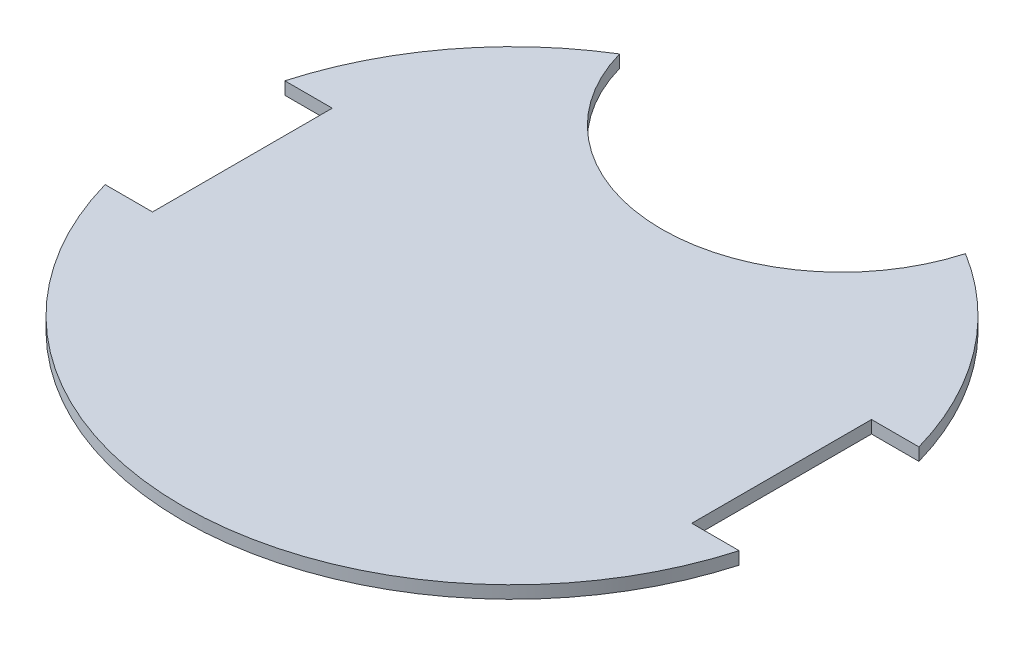
ISO-10303-21;
HEADER;
FILE_DESCRIPTION(('STEP AP214'),'2;1');
FILE_NAME('part.step','',(''),(''),'','','');
FILE_SCHEMA(('AUTOMOTIVE_DESIGN { 1 0 10303 214 1 1 1 1 }'));
ENDSEC;
DATA;
#1=APPLICATION_CONTEXT('core data for automotive mechanical design processes');
#2=APPLICATION_PROTOCOL_DEFINITION('international standard','automotive_design',2000,#1);
#3=PRODUCT_CONTEXT('',#1,'mechanical');
#4=PRODUCT('Part','Part','',(#3));
#5=PRODUCT_RELATED_PRODUCT_CATEGORY('part','',(#4));
#6=PRODUCT_DEFINITION_FORMATION('','',#4);
#7=PRODUCT_DEFINITION_CONTEXT('part definition',#1,'design');
#8=PRODUCT_DEFINITION('design','',#6,#7);
#9=PRODUCT_DEFINITION_SHAPE('','',#8);
#10=(LENGTH_UNIT() NAMED_UNIT(*) SI_UNIT(.MILLI.,.METRE.));
#11=(NAMED_UNIT(*) PLANE_ANGLE_UNIT() SI_UNIT($,.RADIAN.));
#12=(NAMED_UNIT(*) SI_UNIT($,.STERADIAN.) SOLID_ANGLE_UNIT());
#13=UNCERTAINTY_MEASURE_WITH_UNIT(LENGTH_MEASURE(1.E-05),#10,'distance_accuracy_value','');
#14=(GEOMETRIC_REPRESENTATION_CONTEXT(3) GLOBAL_UNCERTAINTY_ASSIGNED_CONTEXT((#13)) GLOBAL_UNIT_ASSIGNED_CONTEXT((#10,
#11,#12)) REPRESENTATION_CONTEXT('',''));
#15=CARTESIAN_POINT('',(0.,0.,0.));
#16=DIRECTION('',(0.,0.,1.));
#17=DIRECTION('',(1.,0.,0.));
#18=AXIS2_PLACEMENT_3D('',#15,#16,#17);
#19=CARTESIAN_POINT('',(0.,0.,0.));
#20=DIRECTION('',(0.,1.,0.));
#21=DIRECTION('',(0.,0.,1.));
#22=AXIS2_PLACEMENT_3D('',#19,#20,#21);
#23=CYLINDRICAL_SURFACE('',#22,139.7);
#24=DIRECTION('',(0.,1.,0.));
#25=VECTOR('',#24,1.);
#26=CARTESIAN_POINT('',(134.404166602081,0.,38.1));
#27=LINE('',#26,#25);
#28=CARTESIAN_POINT('',(134.404166602081,5.334,38.1));
#29=VERTEX_POINT('',#28);
#30=CARTESIAN_POINT('',(134.404166602081,0.,38.1));
#31=VERTEX_POINT('',#30);
#32=EDGE_CURVE('E141',#29,#31,#27,.F.);
#33=ORIENTED_EDGE('',*,*,#32,.F.);
#34=CARTESIAN_POINT('',(0.,5.334,0.));
#35=DIRECTION('',(0.,1.,0.));
#36=DIRECTION('',(0.,0.,1.));
#37=AXIS2_PLACEMENT_3D('',#34,#35,#36);
#38=CIRCLE('',#37,139.7);
#39=CARTESIAN_POINT('',(-134.404166602081,5.334,38.1));
#40=VERTEX_POINT('',#39);
#41=EDGE_CURVE('E174',#40,#29,#38,.T.);
#42=ORIENTED_EDGE('',*,*,#41,.F.);
#43=DIRECTION('',(0.,1.,0.));
#44=VECTOR('',#43,1.);
#45=CARTESIAN_POINT('',(-134.404166602081,0.,38.1));
#46=LINE('',#45,#44);
#47=CARTESIAN_POINT('',(-134.404166602081,0.,38.1));
#48=VERTEX_POINT('',#47);
#49=EDGE_CURVE('E161',#48,#40,#46,.T.);
#50=ORIENTED_EDGE('',*,*,#49,.F.);
#51=CARTESIAN_POINT('',(0.,0.,0.));
#52=DIRECTION('',(0.,1.,0.));
#53=DIRECTION('',(0.,0.,1.));
#54=AXIS2_PLACEMENT_3D('',#51,#52,#53);
#55=CIRCLE('',#54,139.7);
#56=EDGE_CURVE('E182',#48,#31,#55,.T.);
#57=ORIENTED_EDGE('',*,*,#56,.T.);
#58=EDGE_LOOP('',(#33,#42,#50,#57));
#59=FACE_BOUND('',#58,.T.);
#60=ADVANCED_FACE('F36',(#59),#23,.T.);
#61=DIRECTION('',(0.,1.,0.));
#62=VECTOR('',#61,1.);
#63=CARTESIAN_POINT('',(134.404166602081,0.,-38.1));
#64=LINE('',#63,#62);
#65=CARTESIAN_POINT('',(134.404166602081,0.,-38.1));
#66=VERTEX_POINT('',#65);
#67=CARTESIAN_POINT('',(134.404166602081,5.334,-38.1));
#68=VERTEX_POINT('',#67);
#69=EDGE_CURVE('E50',#66,#68,#64,.T.);
#70=ORIENTED_EDGE('',*,*,#69,.F.);
#71=CARTESIAN_POINT('',(73.3113636011353,0.,-118.918181818182));
#72=VERTEX_POINT('',#71);
#73=EDGE_CURVE('E131',#66,#72,#55,.T.);
#74=ORIENTED_EDGE('',*,*,#73,.T.);
#75=DIRECTION('',(0.,1.,0.));
#76=VECTOR('',#75,1.);
#77=CARTESIAN_POINT('',(73.3113636011353,0.,-118.918181818182));
#78=LINE('',#77,#76);
#79=CARTESIAN_POINT('',(73.3113636011353,5.334,-118.918181818182));
#80=VERTEX_POINT('',#79);
#81=EDGE_CURVE('E175',#72,#80,#78,.T.);
#82=ORIENTED_EDGE('',*,*,#81,.T.);
#83=EDGE_CURVE('E171',#68,#80,#38,.T.);
#84=ORIENTED_EDGE('',*,*,#83,.F.);
#85=EDGE_LOOP('',(#70,#74,#82,#84));
#86=FACE_BOUND('',#85,.T.);
#87=ADVANCED_FACE('F210',(#86),#23,.T.);
#88=CARTESIAN_POINT('',(0.,0.,0.));
#89=DIRECTION('',(0.,1.,0.));
#90=DIRECTION('',(0.,0.,1.));
#91=AXIS2_PLACEMENT_3D('',#88,#89,#90);
#92=PLANE('',#91);
#93=DIRECTION('',(0.,0.,1.));
#94=VECTOR('',#93,1.);
#95=CARTESIAN_POINT('',(114.3,0.,-38.1));
#96=LINE('',#95,#94);
#97=CARTESIAN_POINT('',(114.3,0.,-38.1));
#98=VERTEX_POINT('',#97);
#99=CARTESIAN_POINT('',(114.3,0.,38.1));
#100=VERTEX_POINT('',#99);
#101=EDGE_CURVE('E123',#98,#100,#96,.T.);
#102=ORIENTED_EDGE('',*,*,#101,.T.);
#103=DIRECTION('',(1.,0.,0.));
#104=VECTOR('',#103,1.);
#105=CARTESIAN_POINT('',(165.1,0.,38.1));
#106=LINE('',#105,#104);
#107=EDGE_CURVE('E120',#100,#31,#106,.T.);
#108=ORIENTED_EDGE('',*,*,#107,.T.);
#109=ORIENTED_EDGE('',*,*,#56,.F.);
#110=DIRECTION('',(1.,0.,0.));
#111=VECTOR('',#110,1.);
#112=CARTESIAN_POINT('',(-165.1,0.,38.1));
#113=LINE('',#112,#111);
#114=CARTESIAN_POINT('',(-114.3,0.,38.1));
#115=VERTEX_POINT('',#114);
#116=EDGE_CURVE('E150',#48,#115,#113,.T.);
#117=ORIENTED_EDGE('',*,*,#116,.T.);
#118=DIRECTION('',(0.,0.,-1.));
#119=VECTOR('',#118,1.);
#120=CARTESIAN_POINT('',(-114.3,0.,-38.1));
#121=LINE('',#120,#119);
#122=CARTESIAN_POINT('',(-114.3,0.,-38.1));
#123=VERTEX_POINT('',#122);
#124=EDGE_CURVE('E143',#115,#123,#121,.T.);
#125=ORIENTED_EDGE('',*,*,#124,.T.);
#126=DIRECTION('',(-1.,0.,0.));
#127=VECTOR('',#126,1.);
#128=CARTESIAN_POINT('',(-165.1,0.,-38.1));
#129=LINE('',#128,#127);
#130=CARTESIAN_POINT('',(-134.404166602081,0.,-38.1));
#131=VERTEX_POINT('',#130);
#132=EDGE_CURVE('E146',#123,#131,#129,.T.);
#133=ORIENTED_EDGE('',*,*,#132,.T.);
#134=CARTESIAN_POINT('',(-73.3113636011352,0.,-118.918181818182));
#135=VERTEX_POINT('',#134);
#136=EDGE_CURVE('E180',#135,#131,#55,.T.);
#137=ORIENTED_EDGE('',*,*,#136,.F.);
#138=CARTESIAN_POINT('',(0.,0.,-139.7));
#139=DIRECTION('',(0.,-1.,0.));
#140=DIRECTION('',(0.,0.,1.));
#141=AXIS2_PLACEMENT_3D('',#138,#139,#140);
#142=CIRCLE('',#141,76.2);
#143=EDGE_CURVE('E164',#72,#135,#142,.T.);
#144=ORIENTED_EDGE('',*,*,#143,.F.);
#145=ORIENTED_EDGE('',*,*,#73,.F.);
#146=DIRECTION('',(-1.,0.,0.));
#147=VECTOR('',#146,1.);
#148=CARTESIAN_POINT('',(165.1,0.,-38.1));
#149=LINE('',#148,#147);
#150=EDGE_CURVE('E115',#66,#98,#149,.T.);
#151=ORIENTED_EDGE('',*,*,#150,.T.);
#152=EDGE_LOOP('',(#102,#108,#109,#117,#125,#133,#137,#144,#145,#151));
#153=FACE_BOUND('',#152,.T.);
#154=ADVANCED_FACE('F38',(#153),#92,.F.);
#155=DIRECTION('',(0.,1.,0.));
#156=VECTOR('',#155,1.);
#157=CARTESIAN_POINT('',(-134.404166602081,0.,-38.1));
#158=LINE('',#157,#156);
#159=CARTESIAN_POINT('',(-134.404166602081,5.334,-38.1));
#160=VERTEX_POINT('',#159);
#161=EDGE_CURVE('E158',#160,#131,#158,.F.);
#162=ORIENTED_EDGE('',*,*,#161,.F.);
#163=CARTESIAN_POINT('',(-73.3113636011352,5.334,-118.918181818182));
#164=VERTEX_POINT('',#163);
#165=EDGE_CURVE('E168',#164,#160,#38,.T.);
#166=ORIENTED_EDGE('',*,*,#165,.F.);
#167=DIRECTION('',(0.,1.,0.));
#168=VECTOR('',#167,1.);
#169=CARTESIAN_POINT('',(-73.3113636011352,0.,-118.918181818182));
#170=LINE('',#169,#168);
#171=EDGE_CURVE('E167',#135,#164,#170,.T.);
#172=ORIENTED_EDGE('',*,*,#171,.F.);
#173=ORIENTED_EDGE('',*,*,#136,.T.);
#174=EDGE_LOOP('',(#162,#166,#172,#173));
#175=FACE_BOUND('',#174,.T.);
#176=ADVANCED_FACE('F200',(#175),#23,.T.);
#177=CARTESIAN_POINT('',(0.,0.,-139.7));
#178=DIRECTION('',(0.,1.,0.));
#179=DIRECTION('',(0.,0.,1.));
#180=AXIS2_PLACEMENT_3D('',#177,#178,#179);
#181=CYLINDRICAL_SURFACE('',#180,76.2);
#182=CARTESIAN_POINT('',(0.,5.334,-139.7));
#183=DIRECTION('',(0.,-1.,0.));
#184=DIRECTION('',(0.,0.,1.));
#185=AXIS2_PLACEMENT_3D('',#182,#183,#184);
#186=CIRCLE('',#185,76.2);
#187=EDGE_CURVE('E163',#80,#164,#186,.T.);
#188=ORIENTED_EDGE('',*,*,#187,.F.);
#189=ORIENTED_EDGE('',*,*,#81,.F.);
#190=ORIENTED_EDGE('',*,*,#143,.T.);
#191=ORIENTED_EDGE('',*,*,#171,.T.);
#192=EDGE_LOOP('',(#188,#189,#190,#191));
#193=FACE_BOUND('',#192,.T.);
#194=ADVANCED_FACE('F212',(#193),#181,.F.);
#195=CARTESIAN_POINT('',(0.,5.334,0.));
#196=DIRECTION('',(0.,1.,0.));
#197=DIRECTION('',(0.,0.,1.));
#198=AXIS2_PLACEMENT_3D('',#195,#196,#197);
#199=PLANE('',#198);
#200=DIRECTION('',(1.,0.,0.));
#201=VECTOR('',#200,1.);
#202=CARTESIAN_POINT('',(165.1,5.334,38.1));
#203=LINE('',#202,#201);
#204=CARTESIAN_POINT('',(114.3,5.334,38.1));
#205=VERTEX_POINT('',#204);
#206=EDGE_CURVE('E132',#205,#29,#203,.T.);
#207=ORIENTED_EDGE('',*,*,#206,.F.);
#208=DIRECTION('',(0.,0.,1.));
#209=VECTOR('',#208,1.);
#210=CARTESIAN_POINT('',(114.3,5.334,-38.1));
#211=LINE('',#210,#209);
#212=CARTESIAN_POINT('',(114.3,5.334,-38.1));
#213=VERTEX_POINT('',#212);
#214=EDGE_CURVE('E134',#213,#205,#211,.T.);
#215=ORIENTED_EDGE('',*,*,#214,.F.);
#216=DIRECTION('',(-1.,0.,0.));
#217=VECTOR('',#216,1.);
#218=CARTESIAN_POINT('',(0.,5.334,-38.1));
#219=LINE('',#218,#217);
#220=EDGE_CURVE('E12',#68,#213,#219,.T.);
#221=ORIENTED_EDGE('',*,*,#220,.F.);
#222=ORIENTED_EDGE('',*,*,#83,.T.);
#223=ORIENTED_EDGE('',*,*,#187,.T.);
#224=ORIENTED_EDGE('',*,*,#165,.T.);
#225=DIRECTION('',(-1.,0.,0.));
#226=VECTOR('',#225,1.);
#227=CARTESIAN_POINT('',(-165.1,5.334,-38.1));
#228=LINE('',#227,#226);
#229=CARTESIAN_POINT('',(-114.3,5.334,-38.1));
#230=VERTEX_POINT('',#229);
#231=EDGE_CURVE('E147',#230,#160,#228,.T.);
#232=ORIENTED_EDGE('',*,*,#231,.F.);
#233=DIRECTION('',(0.,0.,-1.));
#234=VECTOR('',#233,1.);
#235=CARTESIAN_POINT('',(-114.3,5.334,-38.1));
#236=LINE('',#235,#234);
#237=CARTESIAN_POINT('',(-114.3,5.334,38.1));
#238=VERTEX_POINT('',#237);
#239=EDGE_CURVE('E58',#238,#230,#236,.T.);
#240=ORIENTED_EDGE('',*,*,#239,.F.);
#241=DIRECTION('',(1.,0.,0.));
#242=VECTOR('',#241,1.);
#243=CARTESIAN_POINT('',(0.,5.334,38.1));
#244=LINE('',#243,#242);
#245=EDGE_CURVE('E44',#40,#238,#244,.T.);
#246=ORIENTED_EDGE('',*,*,#245,.F.);
#247=ORIENTED_EDGE('',*,*,#41,.T.);
#248=EDGE_LOOP('',(#207,#215,#221,#222,#223,#224,#232,#240,#246,#247));
#249=FACE_BOUND('',#248,.T.);
#250=ADVANCED_FACE('F194',(#249),#199,.T.);
#251=CARTESIAN_POINT('',(-114.3,0.,-38.1));
#252=DIRECTION('',(1.,0.,0.));
#253=DIRECTION('',(0.,0.,-1.));
#254=AXIS2_PLACEMENT_3D('',#251,#252,#253);
#255=PLANE('',#254);
#256=ORIENTED_EDGE('',*,*,#239,.T.);
#257=DIRECTION('',(0.,1.,0.));
#258=VECTOR('',#257,1.);
#259=CARTESIAN_POINT('',(-114.3,0.,-38.1));
#260=LINE('',#259,#258);
#261=EDGE_CURVE('E153',#123,#230,#260,.T.);
#262=ORIENTED_EDGE('',*,*,#261,.F.);
#263=ORIENTED_EDGE('',*,*,#124,.F.);
#264=DIRECTION('',(0.,1.,0.));
#265=VECTOR('',#264,1.);
#266=CARTESIAN_POINT('',(-114.3,0.,38.1));
#267=LINE('',#266,#265);
#268=EDGE_CURVE('E156',#115,#238,#267,.T.);
#269=ORIENTED_EDGE('',*,*,#268,.T.);
#270=EDGE_LOOP('',(#256,#262,#263,#269));
#271=FACE_BOUND('',#270,.T.);
#272=ADVANCED_FACE('F191',(#271),#255,.F.);
#273=CARTESIAN_POINT('',(-165.1,0.,38.1));
#274=DIRECTION('',(0.,0.,1.));
#275=DIRECTION('',(1.,0.,0.));
#276=AXIS2_PLACEMENT_3D('',#273,#274,#275);
#277=PLANE('',#276);
#278=ORIENTED_EDGE('',*,*,#49,.T.);
#279=ORIENTED_EDGE('',*,*,#245,.T.);
#280=ORIENTED_EDGE('',*,*,#268,.F.);
#281=ORIENTED_EDGE('',*,*,#116,.F.);
#282=EDGE_LOOP('',(#278,#279,#280,#281));
#283=FACE_BOUND('',#282,.T.);
#284=ADVANCED_FACE('F185',(#283),#277,.F.);
#285=CARTESIAN_POINT('',(-165.1,0.,-38.1));
#286=DIRECTION('',(0.,0.,-1.));
#287=DIRECTION('',(-1.,0.,0.));
#288=AXIS2_PLACEMENT_3D('',#285,#286,#287);
#289=PLANE('',#288);
#290=ORIENTED_EDGE('',*,*,#161,.T.);
#291=ORIENTED_EDGE('',*,*,#132,.F.);
#292=ORIENTED_EDGE('',*,*,#261,.T.);
#293=ORIENTED_EDGE('',*,*,#231,.T.);
#294=EDGE_LOOP('',(#290,#291,#292,#293));
#295=FACE_BOUND('',#294,.T.);
#296=ADVANCED_FACE('F197',(#295),#289,.F.);
#297=CARTESIAN_POINT('',(165.1,0.,38.1));
#298=DIRECTION('',(0.,0.,1.));
#299=DIRECTION('',(1.,0.,0.));
#300=AXIS2_PLACEMENT_3D('',#297,#298,#299);
#301=PLANE('',#300);
#302=ORIENTED_EDGE('',*,*,#32,.T.);
#303=ORIENTED_EDGE('',*,*,#107,.F.);
#304=DIRECTION('',(0.,1.,0.));
#305=VECTOR('',#304,1.);
#306=CARTESIAN_POINT('',(114.3,0.,38.1));
#307=LINE('',#306,#305);
#308=EDGE_CURVE('E119',#100,#205,#307,.T.);
#309=ORIENTED_EDGE('',*,*,#308,.T.);
#310=ORIENTED_EDGE('',*,*,#206,.T.);
#311=EDGE_LOOP('',(#302,#303,#309,#310));
#312=FACE_BOUND('',#311,.T.);
#313=ADVANCED_FACE('F229',(#312),#301,.F.);
#314=CARTESIAN_POINT('',(114.3,0.,-38.1));
#315=DIRECTION('',(-1.,0.,0.));
#316=DIRECTION('',(0.,0.,1.));
#317=AXIS2_PLACEMENT_3D('',#314,#315,#316);
#318=PLANE('',#317);
#319=ORIENTED_EDGE('',*,*,#214,.T.);
#320=ORIENTED_EDGE('',*,*,#308,.F.);
#321=ORIENTED_EDGE('',*,*,#101,.F.);
#322=DIRECTION('',(0.,1.,0.));
#323=VECTOR('',#322,1.);
#324=CARTESIAN_POINT('',(114.3,0.,-38.1));
#325=LINE('',#324,#323);
#326=EDGE_CURVE('E111',#98,#213,#325,.T.);
#327=ORIENTED_EDGE('',*,*,#326,.T.);
#328=EDGE_LOOP('',(#319,#320,#321,#327));
#329=FACE_BOUND('',#328,.T.);
#330=ADVANCED_FACE('F124',(#329),#318,.F.);
#331=CARTESIAN_POINT('',(165.1,0.,-38.1));
#332=DIRECTION('',(0.,0.,-1.));
#333=DIRECTION('',(-1.,0.,0.));
#334=AXIS2_PLACEMENT_3D('',#331,#332,#333);
#335=PLANE('',#334);
#336=ORIENTED_EDGE('',*,*,#69,.T.);
#337=ORIENTED_EDGE('',*,*,#220,.T.);
#338=ORIENTED_EDGE('',*,*,#326,.F.);
#339=ORIENTED_EDGE('',*,*,#150,.F.);
#340=EDGE_LOOP('',(#336,#337,#338,#339));
#341=FACE_BOUND('',#340,.T.);
#342=ADVANCED_FACE('F113',(#341),#335,.F.);
#343=CLOSED_SHELL('',(#60,#87,#154,#176,#194,#250,#272,#284,#296,#313,#330,#342));
#344=MANIFOLD_SOLID_BREP('B2',#343);
#345=ADVANCED_BREP_SHAPE_REPRESENTATION('',(#18,#344),#14);
#346=SHAPE_DEFINITION_REPRESENTATION(#9,#345);
ENDSEC;
END-ISO-10303-21;
